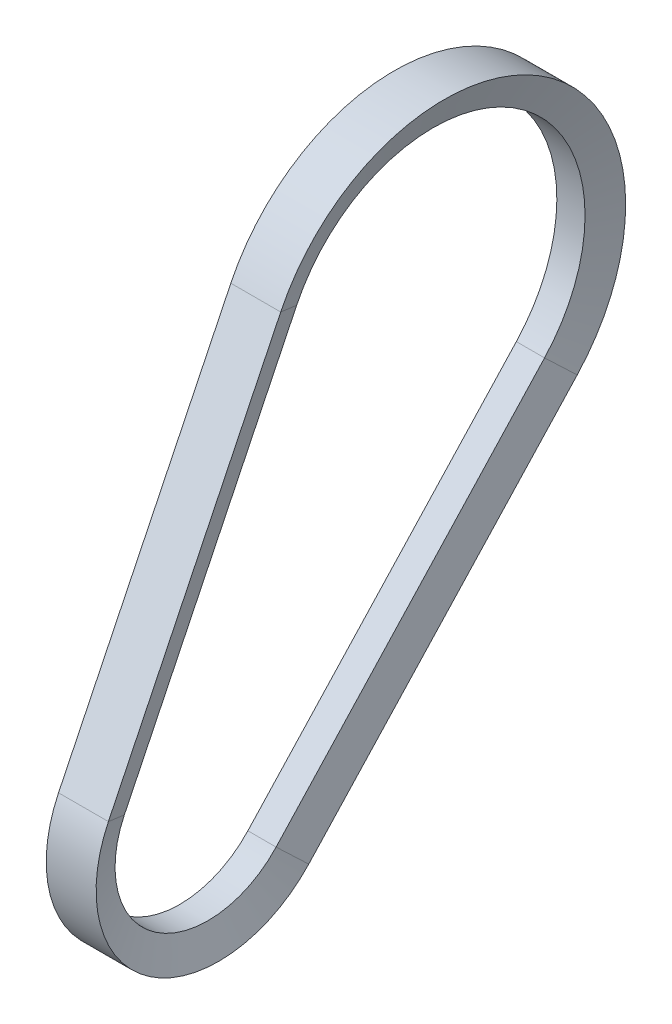
ISO-10303-21;
HEADER;
FILE_DESCRIPTION(('STEP AP214'),'2;1');
FILE_NAME('part.step','',(''),(''),'','','');
FILE_SCHEMA(('AUTOMOTIVE_DESIGN { 1 0 10303 214 1 1 1 1 }'));
ENDSEC;
DATA;
#1=APPLICATION_CONTEXT('core data for automotive mechanical design processes');
#2=APPLICATION_PROTOCOL_DEFINITION('international standard','automotive_design',2000,#1);
#3=PRODUCT_CONTEXT('',#1,'mechanical');
#4=PRODUCT('Part','Part','',(#3));
#5=PRODUCT_RELATED_PRODUCT_CATEGORY('part','',(#4));
#6=PRODUCT_DEFINITION_FORMATION('','',#4);
#7=PRODUCT_DEFINITION_CONTEXT('part definition',#1,'design');
#8=PRODUCT_DEFINITION('design','',#6,#7);
#9=PRODUCT_DEFINITION_SHAPE('','',#8);
#10=(LENGTH_UNIT() NAMED_UNIT(*) SI_UNIT(.MILLI.,.METRE.));
#11=(NAMED_UNIT(*) PLANE_ANGLE_UNIT() SI_UNIT($,.RADIAN.));
#12=(NAMED_UNIT(*) SI_UNIT($,.STERADIAN.) SOLID_ANGLE_UNIT());
#13=UNCERTAINTY_MEASURE_WITH_UNIT(LENGTH_MEASURE(1.E-05),#10,'distance_accuracy_value','');
#14=(GEOMETRIC_REPRESENTATION_CONTEXT(3) GLOBAL_UNCERTAINTY_ASSIGNED_CONTEXT((#13)) GLOBAL_UNIT_ASSIGNED_CONTEXT((#10,
#11,#12)) REPRESENTATION_CONTEXT('',''));
#15=CARTESIAN_POINT('',(0.,0.,0.));
#16=DIRECTION('',(0.,0.,1.));
#17=DIRECTION('',(1.,0.,0.));
#18=AXIS2_PLACEMENT_3D('',#15,#16,#17);
#19=CARTESIAN_POINT('',(-9.85,21.05,28.));
#20=DIRECTION('',(-1.,0.,0.));
#21=DIRECTION('',(0.,0.,1.));
#22=AXIS2_PLACEMENT_3D('',#19,#20,#21);
#23=CONICAL_SURFACE('',#22,15.25,1.22173047639603);
#24=DIRECTION('',(0.342020143325666,0.639027857563817,0.688959809289983));
#25=VECTOR('',#24,1.);
#26=CARTESIAN_POINT('',(-8.50331013321507,13.1955467547577,19.5318204897213));
#27=LINE('',#26,#25);
#28=CARTESIAN_POINT('',(-9.85,10.6794015593122,16.8190703435714));
#29=VERTEX_POINT('',#28);
#30=CARTESIAN_POINT('',(-8.50331013321507,13.1955467547578,19.5318204897213));
#31=VERTEX_POINT('',#30);
#32=EDGE_CURVE('E155',#29,#31,#27,.T.);
#33=ORIENTED_EDGE('',*,*,#32,.F.);
#34=CARTESIAN_POINT('',(-9.85,21.05,28.));
#35=DIRECTION('',(-1.,0.,0.));
#36=DIRECTION('',(0.,-0.680039242012315,-0.733175715175643));
#37=AXIS2_PLACEMENT_3D('',#34,#35,#36);
#38=CIRCLE('',#37,15.25);
#39=CARTESIAN_POINT('',(-9.85,27.7061656197008,41.7207127818898));
#40=VERTEX_POINT('',#39);
#41=EDGE_CURVE('E154',#29,#40,#38,.T.);
#42=ORIENTED_EDGE('',*,*,#41,.T.);
#43=DIRECTION('',(0.342020143325666,-0.410147522331913,-0.845459183807523));
#44=VECTOR('',#43,1.);
#45=CARTESIAN_POINT('',(-8.50331013321507,26.0912270759045,38.3917529593985));
#46=LINE('',#45,#44);
#47=CARTESIAN_POINT('',(-8.50331013321507,26.0912270759045,38.3917529593985));
#48=VERTEX_POINT('',#47);
#49=EDGE_CURVE('E133',#40,#48,#46,.T.);
#50=ORIENTED_EDGE('',*,*,#49,.T.);
#51=CARTESIAN_POINT('',(-8.50331013321507,21.05,28.));
#52=DIRECTION('',(-1.,0.,0.));
#53=DIRECTION('',(0.,-0.680039242012315,-0.733175715175643));
#54=AXIS2_PLACEMENT_3D('',#51,#52,#53);
#55=CIRCLE('',#54,11.55);
#56=EDGE_CURVE('E159',#31,#48,#55,.T.);
#57=ORIENTED_EDGE('',*,*,#56,.F.);
#58=EDGE_LOOP('',(#33,#42,#50,#57));
#59=FACE_BOUND('',#58,.T.);
#60=ADVANCED_FACE('F39',(#59),#23,.F.);
#61=CARTESIAN_POINT('',(-8.50331013321507,26.0912270759045,38.3917529593985));
#62=DIRECTION('',(0.939692620785909,0.149281489786848,0.307721977192934));
#63=DIRECTION('',(0.311209156874488,0.,-0.950341444259625));
#64=AXIS2_PLACEMENT_3D('',#61,#62,#63);
#65=PLANE('',#64);
#66=DIRECTION('',(0.,0.899718870943592,-0.436469876701689));
#67=VECTOR('',#66,1.);
#68=CARTESIAN_POINT('',(-8.50331013321507,26.0912270759045,38.3917529593985));
#69=LINE('',#68,#67);
#70=CARTESIAN_POINT('',(-8.50331013321507,70.2356134602545,16.9765137057839));
#71=VERTEX_POINT('',#70);
#72=EDGE_CURVE('E123',#48,#71,#69,.T.);
#73=ORIENTED_EDGE('',*,*,#72,.F.);
#74=ORIENTED_EDGE('',*,*,#49,.F.);
#75=DIRECTION('',(0.,0.899718870943592,-0.436469876701689));
#76=VECTOR('',#75,1.);
#77=CARTESIAN_POINT('',(-9.85,27.7061656197008,41.7207127818898));
#78=LINE('',#77,#76);
#79=CARTESIAN_POINT('',(-9.85,71.8505520040507,20.3054735282752));
#80=VERTEX_POINT('',#79);
#81=EDGE_CURVE('E136',#40,#80,#78,.T.);
#82=ORIENTED_EDGE('',*,*,#81,.T.);
#83=DIRECTION('',(0.342020143325666,-0.410147522331913,-0.845459183807523));
#84=VECTOR('',#83,1.);
#85=CARTESIAN_POINT('',(-8.50331013321507,70.2356134602545,16.9765137057839));
#86=LINE('',#85,#84);
#87=EDGE_CURVE('E151',#80,#71,#86,.T.);
#88=ORIENTED_EDGE('',*,*,#87,.T.);
#89=EDGE_LOOP('',(#73,#74,#82,#88));
#90=FACE_BOUND('',#89,.T.);
#91=ADVANCED_FACE('F135',(#90),#65,.F.);
#92=CARTESIAN_POINT('',(-4.99668986678494,26.0912270759045,38.3917529593985));
#93=DIRECTION('',(0.,0.43646987670169,0.899718870943592));
#94=DIRECTION('',(0.,-0.899718870943592,0.43646987670169));
#95=AXIS2_PLACEMENT_3D('',#92,#93,#94);
#96=PLANE('',#95);
#97=DIRECTION('',(0.,0.899718870943592,-0.436469876701689));
#98=VECTOR('',#97,1.);
#99=CARTESIAN_POINT('',(-4.99668986678494,26.0912270759045,38.3917529593985));
#100=LINE('',#99,#98);
#101=CARTESIAN_POINT('',(-4.99668986678494,26.0912270759045,38.3917529593985));
#102=VERTEX_POINT('',#101);
#103=CARTESIAN_POINT('',(-4.99668986678494,70.2356134602545,16.9765137057839));
#104=VERTEX_POINT('',#103);
#105=EDGE_CURVE('E117',#102,#104,#100,.T.);
#106=ORIENTED_EDGE('',*,*,#105,.F.);
#107=DIRECTION('',(1.,0.,0.));
#108=VECTOR('',#107,1.);
#109=CARTESIAN_POINT('',(-4.99668986678494,26.0912270759045,38.3917529593985));
#110=LINE('',#109,#108);
#111=EDGE_CURVE('E141',#48,#102,#110,.T.);
#112=ORIENTED_EDGE('',*,*,#111,.F.);
#113=ORIENTED_EDGE('',*,*,#72,.T.);
#114=DIRECTION('',(1.,0.,0.));
#115=VECTOR('',#114,1.);
#116=CARTESIAN_POINT('',(-4.99668986678494,70.2356134602545,16.9765137057839));
#117=LINE('',#116,#115);
#118=EDGE_CURVE('E192',#71,#104,#117,.T.);
#119=ORIENTED_EDGE('',*,*,#118,.T.);
#120=EDGE_LOOP('',(#106,#112,#113,#119));
#121=FACE_BOUND('',#120,.T.);
#122=ADVANCED_FACE('F218',(#121),#96,.F.);
#123=CARTESIAN_POINT('',(-3.65,27.7061656197008,41.7207127818898));
#124=DIRECTION('',(-0.939692620785909,0.149281489786847,0.307721977192933));
#125=DIRECTION('',(0.311209156874487,0.,0.950341444259626));
#126=AXIS2_PLACEMENT_3D('',#123,#124,#125);
#127=PLANE('',#126);
#128=DIRECTION('',(0.,0.899718870943592,-0.436469876701689));
#129=VECTOR('',#128,1.);
#130=CARTESIAN_POINT('',(-3.65,27.7061656197008,41.7207127818898));
#131=LINE('',#130,#129);
#132=CARTESIAN_POINT('',(-3.65,27.7061656197008,41.7207127818898));
#133=VERTEX_POINT('',#132);
#134=CARTESIAN_POINT('',(-3.65,71.8505520040507,20.3054735282752));
#135=VERTEX_POINT('',#134);
#136=EDGE_CURVE('E169',#133,#135,#131,.T.);
#137=ORIENTED_EDGE('',*,*,#136,.F.);
#138=DIRECTION('',(0.342020143325666,0.410147522331913,0.845459183807523));
#139=VECTOR('',#138,1.);
#140=CARTESIAN_POINT('',(-3.65,27.7061656197008,41.7207127818898));
#141=LINE('',#140,#139);
#142=EDGE_CURVE('E162',#102,#133,#141,.T.);
#143=ORIENTED_EDGE('',*,*,#142,.F.);
#144=ORIENTED_EDGE('',*,*,#105,.T.);
#145=DIRECTION('',(0.342020143325666,0.410147522331913,0.845459183807523));
#146=VECTOR('',#145,1.);
#147=CARTESIAN_POINT('',(-3.65,71.8505520040508,20.3054735282752));
#148=LINE('',#147,#146);
#149=EDGE_CURVE('E191',#104,#135,#148,.T.);
#150=ORIENTED_EDGE('',*,*,#149,.T.);
#151=EDGE_LOOP('',(#137,#143,#144,#150));
#152=FACE_BOUND('',#151,.T.);
#153=ADVANCED_FACE('F190',(#152),#127,.F.);
#154=CARTESIAN_POINT('',(-9.85,27.7061656197008,41.7207127818898));
#155=DIRECTION('',(0.,-0.43646987670169,-0.899718870943592));
#156=DIRECTION('',(0.,0.899718870943592,-0.43646987670169));
#157=AXIS2_PLACEMENT_3D('',#154,#155,#156);
#158=PLANE('',#157);
#159=DIRECTION('',(-1.,0.,0.));
#160=VECTOR('',#159,1.);
#161=CARTESIAN_POINT('',(-9.85,71.8505520040508,20.3054735282752));
#162=LINE('',#161,#160);
#163=EDGE_CURVE('E149',#135,#80,#162,.T.);
#164=ORIENTED_EDGE('',*,*,#163,.T.);
#165=ORIENTED_EDGE('',*,*,#81,.F.);
#166=DIRECTION('',(-1.,0.,0.));
#167=VECTOR('',#166,1.);
#168=CARTESIAN_POINT('',(-9.85,27.7061656197008,41.7207127818898));
#169=LINE('',#168,#167);
#170=EDGE_CURVE('E148',#133,#40,#169,.T.);
#171=ORIENTED_EDGE('',*,*,#170,.F.);
#172=ORIENTED_EDGE('',*,*,#136,.T.);
#173=EDGE_LOOP('',(#164,#165,#171,#172));
#174=FACE_BOUND('',#173,.T.);
#175=ADVANCED_FACE('F146',(#174),#158,.F.);
#176=CARTESIAN_POINT('',(-9.85,62.,0.));
#177=DIRECTION('',(-1.,0.,0.));
#178=DIRECTION('',(0.,0.,1.));
#179=AXIS2_PLACEMENT_3D('',#176,#177,#178);
#180=CONICAL_SURFACE('',#179,22.5686869354864,1.22173047639603);
#181=CARTESIAN_POINT('',(-8.50331013321507,62.,0.));
#182=DIRECTION('',(-1.,0.,0.));
#183=DIRECTION('',(0.,0.43646987670169,0.899718870943591));
#184=AXIS2_PLACEMENT_3D('',#181,#182,#183);
#185=CIRCLE('',#184,18.8686869354864);
#186=CARTESIAN_POINT('',(-8.50331013321507,49.1685524386242,-13.8340630383505));
#187=VERTEX_POINT('',#186);
#188=EDGE_CURVE('E104',#71,#187,#185,.T.);
#189=ORIENTED_EDGE('',*,*,#188,.F.);
#190=ORIENTED_EDGE('',*,*,#87,.F.);
#191=CARTESIAN_POINT('',(-9.85,62.,0.));
#192=DIRECTION('',(-1.,0.,0.));
#193=DIRECTION('',(0.,0.43646987670169,0.899718870943592));
#194=AXIS2_PLACEMENT_3D('',#191,#192,#193);
#195=CIRCLE('',#194,22.5686869354864);
#196=CARTESIAN_POINT('',(-9.85,46.6524072431786,-16.5468131845004));
#197=VERTEX_POINT('',#196);
#198=EDGE_CURVE('E168',#80,#197,#195,.T.);
#199=ORIENTED_EDGE('',*,*,#198,.T.);
#200=DIRECTION('',(0.342020143325666,0.639027857563816,0.688959809289983));
#201=VECTOR('',#200,1.);
#202=CARTESIAN_POINT('',(-8.50331013321507,49.1685524386242,-13.8340630383505));
#203=LINE('',#202,#201);
#204=EDGE_CURVE('E177',#197,#187,#203,.T.);
#205=ORIENTED_EDGE('',*,*,#204,.T.);
#206=EDGE_LOOP('',(#189,#190,#199,#205));
#207=FACE_BOUND('',#206,.T.);
#208=ADVANCED_FACE('F214',(#207),#180,.F.);
#209=CARTESIAN_POINT('',(-7.24999999999999,62.,0.));
#210=DIRECTION('',(-1.,0.,0.));
#211=DIRECTION('',(0.,0.,1.));
#212=AXIS2_PLACEMENT_3D('',#209,#210,#211);
#213=CYLINDRICAL_SURFACE('',#212,18.8686869354864);
#214=CARTESIAN_POINT('',(-4.99668986678494,62.,0.));
#215=DIRECTION('',(-1.,0.,0.));
#216=DIRECTION('',(0.,0.43646987670169,0.899718870943591));
#217=AXIS2_PLACEMENT_3D('',#214,#215,#216);
#218=CIRCLE('',#217,18.8686869354864);
#219=CARTESIAN_POINT('',(-4.99668986678494,49.1685524386242,-13.8340630383505));
#220=VERTEX_POINT('',#219);
#221=EDGE_CURVE('E97',#104,#220,#218,.T.);
#222=ORIENTED_EDGE('',*,*,#221,.F.);
#223=ORIENTED_EDGE('',*,*,#118,.F.);
#224=ORIENTED_EDGE('',*,*,#188,.T.);
#225=DIRECTION('',(1.,0.,0.));
#226=VECTOR('',#225,1.);
#227=CARTESIAN_POINT('',(-4.99668986678494,49.1685524386242,-13.8340630383505));
#228=LINE('',#227,#226);
#229=EDGE_CURVE('E175',#187,#220,#228,.T.);
#230=ORIENTED_EDGE('',*,*,#229,.T.);
#231=EDGE_LOOP('',(#222,#223,#224,#230));
#232=FACE_BOUND('',#231,.T.);
#233=ADVANCED_FACE('F217',(#232),#213,.F.);
#234=CARTESIAN_POINT('',(-4.99668986678494,62.,0.));
#235=DIRECTION('',(1.,0.,0.));
#236=DIRECTION('',(0.,0.,-1.));
#237=AXIS2_PLACEMENT_3D('',#234,#235,#236);
#238=CONICAL_SURFACE('',#237,18.8686869354864,1.22173047639603);
#239=CARTESIAN_POINT('',(-3.65,62.,0.));
#240=DIRECTION('',(-1.,0.,0.));
#241=DIRECTION('',(0.,0.43646987670169,0.899718870943592));
#242=AXIS2_PLACEMENT_3D('',#239,#240,#241);
#243=CIRCLE('',#242,22.5686869354864);
#244=CARTESIAN_POINT('',(-3.65,46.6524072431786,-16.5468131845004));
#245=VERTEX_POINT('',#244);
#246=EDGE_CURVE('E88',#135,#245,#243,.T.);
#247=ORIENTED_EDGE('',*,*,#246,.F.);
#248=ORIENTED_EDGE('',*,*,#149,.F.);
#249=ORIENTED_EDGE('',*,*,#221,.T.);
#250=DIRECTION('',(0.342020143325666,-0.639027857563817,-0.688959809289983));
#251=VECTOR('',#250,1.);
#252=CARTESIAN_POINT('',(-3.65,46.6524072431786,-16.5468131845004));
#253=LINE('',#252,#251);
#254=EDGE_CURVE('E172',#220,#245,#253,.T.);
#255=ORIENTED_EDGE('',*,*,#254,.T.);
#256=EDGE_LOOP('',(#247,#248,#249,#255));
#257=FACE_BOUND('',#256,.T.);
#258=ADVANCED_FACE('F237',(#257),#238,.F.);
#259=CARTESIAN_POINT('',(-7.24999999999999,62.,0.));
#260=DIRECTION('',(-1.,0.,0.));
#261=DIRECTION('',(0.,0.,1.));
#262=AXIS2_PLACEMENT_3D('',#259,#260,#261);
#263=CYLINDRICAL_SURFACE('',#262,22.5686869354864);
#264=DIRECTION('',(-1.,0.,0.));
#265=VECTOR('',#264,1.);
#266=CARTESIAN_POINT('',(-9.85,46.6524072431786,-16.5468131845004));
#267=LINE('',#266,#265);
#268=EDGE_CURVE('E170',#245,#197,#267,.T.);
#269=ORIENTED_EDGE('',*,*,#268,.T.);
#270=ORIENTED_EDGE('',*,*,#198,.F.);
#271=ORIENTED_EDGE('',*,*,#163,.F.);
#272=ORIENTED_EDGE('',*,*,#246,.T.);
#273=EDGE_LOOP('',(#269,#270,#271,#272));
#274=FACE_BOUND('',#273,.T.);
#275=ADVANCED_FACE('F228',(#274),#263,.T.);
#276=CARTESIAN_POINT('',(-8.50331013321507,49.1685524386242,-13.8340630383505));
#277=DIRECTION('',(0.939692620785909,-0.23258711902013,-0.250760863187271));
#278=DIRECTION('',(-0.2578317530166,0.,-0.966189829762447));
#279=AXIS2_PLACEMENT_3D('',#276,#277,#278);
#280=PLANE('',#279);
#281=DIRECTION('',(0.,-0.733175715175642,0.680039242012316));
#282=VECTOR('',#281,1.);
#283=CARTESIAN_POINT('',(-8.50331013321507,49.1685524386242,-13.8340630383505));
#284=LINE('',#283,#282);
#285=EDGE_CURVE('E199',#187,#31,#284,.T.);
#286=ORIENTED_EDGE('',*,*,#285,.F.);
#287=ORIENTED_EDGE('',*,*,#204,.F.);
#288=DIRECTION('',(0.,-0.733175715175642,0.680039242012316));
#289=VECTOR('',#288,1.);
#290=CARTESIAN_POINT('',(-9.85,46.6524072431786,-16.5468131845004));
#291=LINE('',#290,#289);
#292=EDGE_CURVE('E171',#197,#29,#291,.T.);
#293=ORIENTED_EDGE('',*,*,#292,.T.);
#294=ORIENTED_EDGE('',*,*,#32,.T.);
#295=EDGE_LOOP('',(#286,#287,#293,#294));
#296=FACE_BOUND('',#295,.T.);
#297=ADVANCED_FACE('F226',(#296),#280,.F.);
#298=CARTESIAN_POINT('',(-4.99668986678494,49.1685524386242,-13.8340630383505));
#299=DIRECTION('',(0.,-0.680039242012316,-0.733175715175642));
#300=DIRECTION('',(0.,0.733175715175642,-0.680039242012316));
#301=AXIS2_PLACEMENT_3D('',#298,#299,#300);
#302=PLANE('',#301);
#303=DIRECTION('',(0.,-0.733175715175642,0.680039242012316));
#304=VECTOR('',#303,1.);
#305=CARTESIAN_POINT('',(-4.99668986678494,49.1685524386242,-13.8340630383505));
#306=LINE('',#305,#304);
#307=CARTESIAN_POINT('',(-4.99668986678494,13.1955467547578,19.5318204897213));
#308=VERTEX_POINT('',#307);
#309=EDGE_CURVE('E64',#220,#308,#306,.T.);
#310=ORIENTED_EDGE('',*,*,#309,.F.);
#311=ORIENTED_EDGE('',*,*,#229,.F.);
#312=ORIENTED_EDGE('',*,*,#285,.T.);
#313=DIRECTION('',(1.,0.,0.));
#314=VECTOR('',#313,1.);
#315=CARTESIAN_POINT('',(-4.99668986678494,13.1955467547577,19.5318204897213));
#316=LINE('',#315,#314);
#317=EDGE_CURVE('E197',#31,#308,#316,.T.);
#318=ORIENTED_EDGE('',*,*,#317,.T.);
#319=EDGE_LOOP('',(#310,#311,#312,#318));
#320=FACE_BOUND('',#319,.T.);
#321=ADVANCED_FACE('F223',(#320),#302,.F.);
#322=CARTESIAN_POINT('',(-3.65,46.6524072431786,-16.5468131845004));
#323=DIRECTION('',(-0.939692620785909,-0.232587119020129,-0.250760863187271));
#324=DIRECTION('',(-0.257831753016599,0.,0.966189829762448));
#325=AXIS2_PLACEMENT_3D('',#322,#323,#324);
#326=PLANE('',#325);
#327=DIRECTION('',(0.,-0.733175715175642,0.680039242012316));
#328=VECTOR('',#327,1.);
#329=CARTESIAN_POINT('',(-3.65,46.6524072431786,-16.5468131845004));
#330=LINE('',#329,#328);
#331=CARTESIAN_POINT('',(-3.65,10.6794015593122,16.8190703435714));
#332=VERTEX_POINT('',#331);
#333=EDGE_CURVE('E56',#245,#332,#330,.T.);
#334=ORIENTED_EDGE('',*,*,#333,.F.);
#335=ORIENTED_EDGE('',*,*,#254,.F.);
#336=ORIENTED_EDGE('',*,*,#309,.T.);
#337=DIRECTION('',(0.342020143325666,-0.639027857563817,-0.688959809289983));
#338=VECTOR('',#337,1.);
#339=CARTESIAN_POINT('',(-3.65,10.6794015593122,16.8190703435714));
#340=LINE('',#339,#338);
#341=EDGE_CURVE('E183',#308,#332,#340,.T.);
#342=ORIENTED_EDGE('',*,*,#341,.T.);
#343=EDGE_LOOP('',(#334,#335,#336,#342));
#344=FACE_BOUND('',#343,.T.);
#345=ADVANCED_FACE('F235',(#344),#326,.F.);
#346=CARTESIAN_POINT('',(-9.85,46.6524072431786,-16.5468131845004));
#347=DIRECTION('',(0.,0.680039242012316,0.733175715175642));
#348=DIRECTION('',(0.,-0.733175715175642,0.680039242012316));
#349=AXIS2_PLACEMENT_3D('',#346,#347,#348);
#350=PLANE('',#349);
#351=DIRECTION('',(-1.,0.,0.));
#352=VECTOR('',#351,1.);
#353=CARTESIAN_POINT('',(-9.85,10.6794015593122,16.8190703435714));
#354=LINE('',#353,#352);
#355=EDGE_CURVE('E43',#332,#29,#354,.T.);
#356=ORIENTED_EDGE('',*,*,#355,.T.);
#357=ORIENTED_EDGE('',*,*,#292,.F.);
#358=ORIENTED_EDGE('',*,*,#268,.F.);
#359=ORIENTED_EDGE('',*,*,#333,.T.);
#360=EDGE_LOOP('',(#356,#357,#358,#359));
#361=FACE_BOUND('',#360,.T.);
#362=ADVANCED_FACE('F184',(#361),#350,.F.);
#363=CARTESIAN_POINT('',(-7.24999999999999,21.05,28.));
#364=DIRECTION('',(-1.,0.,0.));
#365=DIRECTION('',(0.,0.,1.));
#366=AXIS2_PLACEMENT_3D('',#363,#364,#365);
#367=CYLINDRICAL_SURFACE('',#366,11.55);
#368=ORIENTED_EDGE('',*,*,#56,.T.);
#369=ORIENTED_EDGE('',*,*,#111,.T.);
#370=CARTESIAN_POINT('',(-4.99668986678494,21.05,28.));
#371=DIRECTION('',(-1.,0.,0.));
#372=DIRECTION('',(0.,-0.680039242012315,-0.733175715175643));
#373=AXIS2_PLACEMENT_3D('',#370,#371,#372);
#374=CIRCLE('',#373,11.55);
#375=EDGE_CURVE('E48',#308,#102,#374,.T.);
#376=ORIENTED_EDGE('',*,*,#375,.F.);
#377=ORIENTED_EDGE('',*,*,#317,.F.);
#378=EDGE_LOOP('',(#368,#369,#376,#377));
#379=FACE_BOUND('',#378,.T.);
#380=ADVANCED_FACE('F220',(#379),#367,.F.);
#381=CARTESIAN_POINT('',(-4.99668986678494,21.05,28.));
#382=DIRECTION('',(1.,0.,0.));
#383=DIRECTION('',(0.,0.,-1.));
#384=AXIS2_PLACEMENT_3D('',#381,#382,#383);
#385=CONICAL_SURFACE('',#384,11.55,1.22173047639603);
#386=ORIENTED_EDGE('',*,*,#375,.T.);
#387=ORIENTED_EDGE('',*,*,#142,.T.);
#388=CARTESIAN_POINT('',(-3.65,21.05,28.));
#389=DIRECTION('',(-1.,0.,0.));
#390=DIRECTION('',(0.,-0.680039242012315,-0.733175715175643));
#391=AXIS2_PLACEMENT_3D('',#388,#389,#390);
#392=CIRCLE('',#391,15.25);
#393=EDGE_CURVE('E11',#332,#133,#392,.T.);
#394=ORIENTED_EDGE('',*,*,#393,.F.);
#395=ORIENTED_EDGE('',*,*,#341,.F.);
#396=EDGE_LOOP('',(#386,#387,#394,#395));
#397=FACE_BOUND('',#396,.T.);
#398=ADVANCED_FACE('F188',(#397),#385,.F.);
#399=CARTESIAN_POINT('',(-7.24999999999999,21.05,28.));
#400=DIRECTION('',(-1.,0.,0.));
#401=DIRECTION('',(0.,0.,1.));
#402=AXIS2_PLACEMENT_3D('',#399,#400,#401);
#403=CYLINDRICAL_SURFACE('',#402,15.25);
#404=ORIENTED_EDGE('',*,*,#393,.T.);
#405=ORIENTED_EDGE('',*,*,#170,.T.);
#406=ORIENTED_EDGE('',*,*,#41,.F.);
#407=ORIENTED_EDGE('',*,*,#355,.F.);
#408=EDGE_LOOP('',(#404,#405,#406,#407));
#409=FACE_BOUND('',#408,.T.);
#410=ADVANCED_FACE('F41',(#409),#403,.T.);
#411=CLOSED_SHELL('',(#60,#91,#122,#153,#175,#208,#233,#258,#275,#297,#321,#345,#362,#380,#398,#410));
#412=MANIFOLD_SOLID_BREP('B2',#411);
#413=ADVANCED_BREP_SHAPE_REPRESENTATION('',(#18,#412),#14);
#414=SHAPE_DEFINITION_REPRESENTATION(#9,#413);
ENDSEC;
END-ISO-10303-21;
